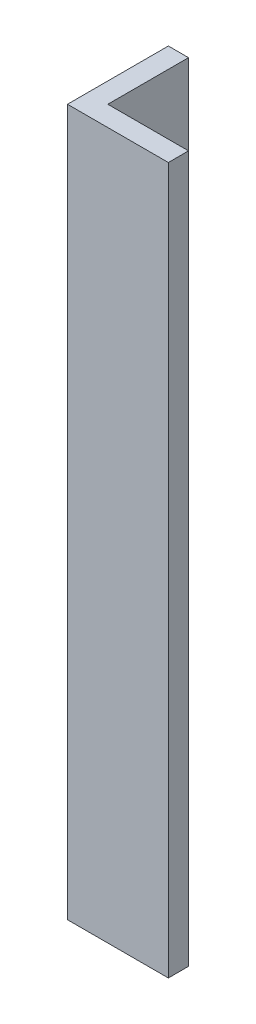
ISO-10303-21;
HEADER;
FILE_DESCRIPTION(('STEP AP214'),'2;1');
FILE_NAME('part.step','',(''),(''),'','','');
FILE_SCHEMA(('AUTOMOTIVE_DESIGN { 1 0 10303 214 1 1 1 1 }'));
ENDSEC;
DATA;
#1=APPLICATION_CONTEXT('core data for automotive mechanical design processes');
#2=APPLICATION_PROTOCOL_DEFINITION('international standard','automotive_design',2000,#1);
#3=PRODUCT_CONTEXT('',#1,'mechanical');
#4=PRODUCT('Part','Part','',(#3));
#5=PRODUCT_RELATED_PRODUCT_CATEGORY('part','',(#4));
#6=PRODUCT_DEFINITION_FORMATION('','',#4);
#7=PRODUCT_DEFINITION_CONTEXT('part definition',#1,'design');
#8=PRODUCT_DEFINITION('design','',#6,#7);
#9=PRODUCT_DEFINITION_SHAPE('','',#8);
#10=(LENGTH_UNIT() NAMED_UNIT(*) SI_UNIT(.MILLI.,.METRE.));
#11=(NAMED_UNIT(*) PLANE_ANGLE_UNIT() SI_UNIT($,.RADIAN.));
#12=(NAMED_UNIT(*) SI_UNIT($,.STERADIAN.) SOLID_ANGLE_UNIT());
#13=UNCERTAINTY_MEASURE_WITH_UNIT(LENGTH_MEASURE(1.E-05),#10,'distance_accuracy_value','');
#14=(GEOMETRIC_REPRESENTATION_CONTEXT(3) GLOBAL_UNCERTAINTY_ASSIGNED_CONTEXT((#13)) GLOBAL_UNIT_ASSIGNED_CONTEXT((#10,
#11,#12)) REPRESENTATION_CONTEXT('',''));
#15=CARTESIAN_POINT('',(0.,0.,0.));
#16=DIRECTION('',(0.,0.,1.));
#17=DIRECTION('',(1.,0.,0.));
#18=AXIS2_PLACEMENT_3D('',#15,#16,#17);
#19=CARTESIAN_POINT('',(0.,70.,-10.));
#20=DIRECTION('',(1.,0.,0.));
#21=DIRECTION('',(0.,0.,-1.));
#22=AXIS2_PLACEMENT_3D('',#19,#20,#21);
#23=PLANE('',#22);
#24=DIRECTION('',(0.,0.,1.));
#25=VECTOR('',#24,1.);
#26=CARTESIAN_POINT('',(0.,0.,-10.));
#27=LINE('',#26,#25);
#28=CARTESIAN_POINT('',(0.,0.,-10.));
#29=VERTEX_POINT('',#28);
#30=CARTESIAN_POINT('',(0.,0.,0.));
#31=VERTEX_POINT('',#30);
#32=EDGE_CURVE('E128',#29,#31,#27,.T.);
#33=ORIENTED_EDGE('',*,*,#32,.T.);
#34=DIRECTION('',(0.,-1.,0.));
#35=VECTOR('',#34,1.);
#36=CARTESIAN_POINT('',(0.,70.,0.));
#37=LINE('',#36,#35);
#38=CARTESIAN_POINT('',(0.,70.,0.));
#39=VERTEX_POINT('',#38);
#40=EDGE_CURVE('E11',#39,#31,#37,.T.);
#41=ORIENTED_EDGE('',*,*,#40,.F.);
#42=DIRECTION('',(0.,0.,1.));
#43=VECTOR('',#42,1.);
#44=CARTESIAN_POINT('',(0.,70.,-10.));
#45=LINE('',#44,#43);
#46=CARTESIAN_POINT('',(0.,70.,-10.));
#47=VERTEX_POINT('',#46);
#48=EDGE_CURVE('E144',#47,#39,#45,.T.);
#49=ORIENTED_EDGE('',*,*,#48,.F.);
#50=DIRECTION('',(0.,-1.,0.));
#51=VECTOR('',#50,1.);
#52=CARTESIAN_POINT('',(0.,70.,-10.));
#53=LINE('',#52,#51);
#54=EDGE_CURVE('E124',#47,#29,#53,.T.);
#55=ORIENTED_EDGE('',*,*,#54,.T.);
#56=EDGE_LOOP('',(#33,#41,#49,#55));
#57=FACE_BOUND('',#56,.T.);
#58=ADVANCED_FACE('F39',(#57),#23,.F.);
#59=CARTESIAN_POINT('',(0.,70.,0.));
#60=DIRECTION('',(0.,0.,-1.));
#61=DIRECTION('',(-1.,0.,0.));
#62=AXIS2_PLACEMENT_3D('',#59,#60,#61);
#63=PLANE('',#62);
#64=DIRECTION('',(1.,0.,0.));
#65=VECTOR('',#64,1.);
#66=CARTESIAN_POINT('',(0.,0.,0.));
#67=LINE('',#66,#65);
#68=CARTESIAN_POINT('',(10.,0.,0.));
#69=VERTEX_POINT('',#68);
#70=EDGE_CURVE('E132',#31,#69,#67,.T.);
#71=ORIENTED_EDGE('',*,*,#70,.T.);
#72=DIRECTION('',(0.,-1.,0.));
#73=VECTOR('',#72,1.);
#74=CARTESIAN_POINT('',(10.,70.,0.));
#75=LINE('',#74,#73);
#76=CARTESIAN_POINT('',(10.,70.,0.));
#77=VERTEX_POINT('',#76);
#78=EDGE_CURVE('E48',#77,#69,#75,.T.);
#79=ORIENTED_EDGE('',*,*,#78,.F.);
#80=DIRECTION('',(1.,0.,0.));
#81=VECTOR('',#80,1.);
#82=CARTESIAN_POINT('',(0.,70.,0.));
#83=LINE('',#82,#81);
#84=EDGE_CURVE('E93',#39,#77,#83,.T.);
#85=ORIENTED_EDGE('',*,*,#84,.F.);
#86=ORIENTED_EDGE('',*,*,#40,.T.);
#87=EDGE_LOOP('',(#71,#79,#85,#86));
#88=FACE_BOUND('',#87,.T.);
#89=ADVANCED_FACE('F172',(#88),#63,.F.);
#90=CARTESIAN_POINT('',(10.,70.,0.));
#91=DIRECTION('',(-1.,0.,0.));
#92=DIRECTION('',(0.,0.,1.));
#93=AXIS2_PLACEMENT_3D('',#90,#91,#92);
#94=PLANE('',#93);
#95=DIRECTION('',(0.,0.,-1.));
#96=VECTOR('',#95,1.);
#97=CARTESIAN_POINT('',(10.,0.,0.));
#98=LINE('',#97,#96);
#99=CARTESIAN_POINT('',(10.,0.,-2.));
#100=VERTEX_POINT('',#99);
#101=EDGE_CURVE('E135',#69,#100,#98,.T.);
#102=ORIENTED_EDGE('',*,*,#101,.T.);
#103=DIRECTION('',(0.,-1.,0.));
#104=VECTOR('',#103,1.);
#105=CARTESIAN_POINT('',(10.,70.,-2.));
#106=LINE('',#105,#104);
#107=CARTESIAN_POINT('',(10.,70.,-2.));
#108=VERTEX_POINT('',#107);
#109=EDGE_CURVE('E117',#108,#100,#106,.T.);
#110=ORIENTED_EDGE('',*,*,#109,.F.);
#111=DIRECTION('',(0.,0.,-1.));
#112=VECTOR('',#111,1.);
#113=CARTESIAN_POINT('',(10.,70.,0.));
#114=LINE('',#113,#112);
#115=EDGE_CURVE('E106',#77,#108,#114,.T.);
#116=ORIENTED_EDGE('',*,*,#115,.F.);
#117=ORIENTED_EDGE('',*,*,#78,.T.);
#118=EDGE_LOOP('',(#102,#110,#116,#117));
#119=FACE_BOUND('',#118,.T.);
#120=ADVANCED_FACE('F154',(#119),#94,.F.);
#121=CARTESIAN_POINT('',(10.,70.,-2.));
#122=DIRECTION('',(0.,0.,1.));
#123=DIRECTION('',(1.,0.,0.));
#124=AXIS2_PLACEMENT_3D('',#121,#122,#123);
#125=PLANE('',#124);
#126=DIRECTION('',(-1.,0.,0.));
#127=VECTOR('',#126,1.);
#128=CARTESIAN_POINT('',(10.,0.,-2.));
#129=LINE('',#128,#127);
#130=CARTESIAN_POINT('',(2.,0.,-2.));
#131=VERTEX_POINT('',#130);
#132=EDGE_CURVE('E115',#100,#131,#129,.T.);
#133=ORIENTED_EDGE('',*,*,#132,.T.);
#134=DIRECTION('',(0.,-1.,0.));
#135=VECTOR('',#134,1.);
#136=CARTESIAN_POINT('',(2.,70.,-2.));
#137=LINE('',#136,#135);
#138=CARTESIAN_POINT('',(2.,70.,-2.));
#139=VERTEX_POINT('',#138);
#140=EDGE_CURVE('E112',#139,#131,#137,.T.);
#141=ORIENTED_EDGE('',*,*,#140,.F.);
#142=DIRECTION('',(-1.,0.,0.));
#143=VECTOR('',#142,1.);
#144=CARTESIAN_POINT('',(10.,70.,-2.));
#145=LINE('',#144,#143);
#146=EDGE_CURVE('E100',#108,#139,#145,.T.);
#147=ORIENTED_EDGE('',*,*,#146,.F.);
#148=ORIENTED_EDGE('',*,*,#109,.T.);
#149=EDGE_LOOP('',(#133,#141,#147,#148));
#150=FACE_BOUND('',#149,.T.);
#151=ADVANCED_FACE('F113',(#150),#125,.F.);
#152=CARTESIAN_POINT('',(2.,70.,-2.));
#153=DIRECTION('',(-1.,0.,0.));
#154=DIRECTION('',(0.,0.,1.));
#155=AXIS2_PLACEMENT_3D('',#152,#153,#154);
#156=PLANE('',#155);
#157=DIRECTION('',(0.,0.,-1.));
#158=VECTOR('',#157,1.);
#159=CARTESIAN_POINT('',(2.,0.,-2.));
#160=LINE('',#159,#158);
#161=CARTESIAN_POINT('',(2.,0.,-10.));
#162=VERTEX_POINT('',#161);
#163=EDGE_CURVE('E79',#131,#162,#160,.T.);
#164=ORIENTED_EDGE('',*,*,#163,.T.);
#165=DIRECTION('',(0.,-1.,0.));
#166=VECTOR('',#165,1.);
#167=CARTESIAN_POINT('',(2.,70.,-10.));
#168=LINE('',#167,#166);
#169=CARTESIAN_POINT('',(2.,70.,-10.));
#170=VERTEX_POINT('',#169);
#171=EDGE_CURVE('E118',#170,#162,#168,.T.);
#172=ORIENTED_EDGE('',*,*,#171,.F.);
#173=DIRECTION('',(0.,0.,-1.));
#174=VECTOR('',#173,1.);
#175=CARTESIAN_POINT('',(2.,70.,-2.));
#176=LINE('',#175,#174);
#177=EDGE_CURVE('E104',#139,#170,#176,.T.);
#178=ORIENTED_EDGE('',*,*,#177,.F.);
#179=ORIENTED_EDGE('',*,*,#140,.T.);
#180=EDGE_LOOP('',(#164,#172,#178,#179));
#181=FACE_BOUND('',#180,.T.);
#182=ADVANCED_FACE('F120',(#181),#156,.F.);
#183=CARTESIAN_POINT('',(2.,70.,-10.));
#184=DIRECTION('',(0.,0.,1.));
#185=DIRECTION('',(1.,0.,0.));
#186=AXIS2_PLACEMENT_3D('',#183,#184,#185);
#187=PLANE('',#186);
#188=DIRECTION('',(-1.,0.,0.));
#189=VECTOR('',#188,1.);
#190=CARTESIAN_POINT('',(2.,0.,-10.));
#191=LINE('',#190,#189);
#192=EDGE_CURVE('E85',#162,#29,#191,.T.);
#193=ORIENTED_EDGE('',*,*,#192,.T.);
#194=ORIENTED_EDGE('',*,*,#54,.F.);
#195=DIRECTION('',(-1.,0.,0.));
#196=VECTOR('',#195,1.);
#197=CARTESIAN_POINT('',(2.,70.,-10.));
#198=LINE('',#197,#196);
#199=EDGE_CURVE('E56',#170,#47,#198,.T.);
#200=ORIENTED_EDGE('',*,*,#199,.F.);
#201=ORIENTED_EDGE('',*,*,#171,.T.);
#202=EDGE_LOOP('',(#193,#194,#200,#201));
#203=FACE_BOUND('',#202,.T.);
#204=ADVANCED_FACE('F161',(#203),#187,.F.);
#205=CARTESIAN_POINT('',(0.,70.,0.));
#206=DIRECTION('',(0.,1.,0.));
#207=DIRECTION('',(0.,0.,1.));
#208=AXIS2_PLACEMENT_3D('',#205,#206,#207);
#209=PLANE('',#208);
#210=ORIENTED_EDGE('',*,*,#48,.T.);
#211=ORIENTED_EDGE('',*,*,#84,.T.);
#212=ORIENTED_EDGE('',*,*,#115,.T.);
#213=ORIENTED_EDGE('',*,*,#146,.T.);
#214=ORIENTED_EDGE('',*,*,#177,.T.);
#215=ORIENTED_EDGE('',*,*,#199,.T.);
#216=EDGE_LOOP('',(#210,#211,#212,#213,#214,#215));
#217=FACE_BOUND('',#216,.T.);
#218=ADVANCED_FACE('F102',(#217),#209,.T.);
#219=CARTESIAN_POINT('',(0.,0.,0.));
#220=DIRECTION('',(0.,1.,0.));
#221=DIRECTION('',(0.,0.,1.));
#222=AXIS2_PLACEMENT_3D('',#219,#220,#221);
#223=PLANE('',#222);
#224=ORIENTED_EDGE('',*,*,#32,.F.);
#225=ORIENTED_EDGE('',*,*,#192,.F.);
#226=ORIENTED_EDGE('',*,*,#163,.F.);
#227=ORIENTED_EDGE('',*,*,#132,.F.);
#228=ORIENTED_EDGE('',*,*,#101,.F.);
#229=ORIENTED_EDGE('',*,*,#70,.F.);
#230=EDGE_LOOP('',(#224,#225,#226,#227,#228,#229));
#231=FACE_BOUND('',#230,.T.);
#232=ADVANCED_FACE('F157',(#231),#223,.F.);
#233=CLOSED_SHELL('',(#58,#89,#120,#151,#182,#204,#218,#232));
#234=MANIFOLD_SOLID_BREP('B2',#233);
#235=ADVANCED_BREP_SHAPE_REPRESENTATION('',(#18,#234),#14);
#236=SHAPE_DEFINITION_REPRESENTATION(#9,#235);
ENDSEC;
END-ISO-10303-21;
